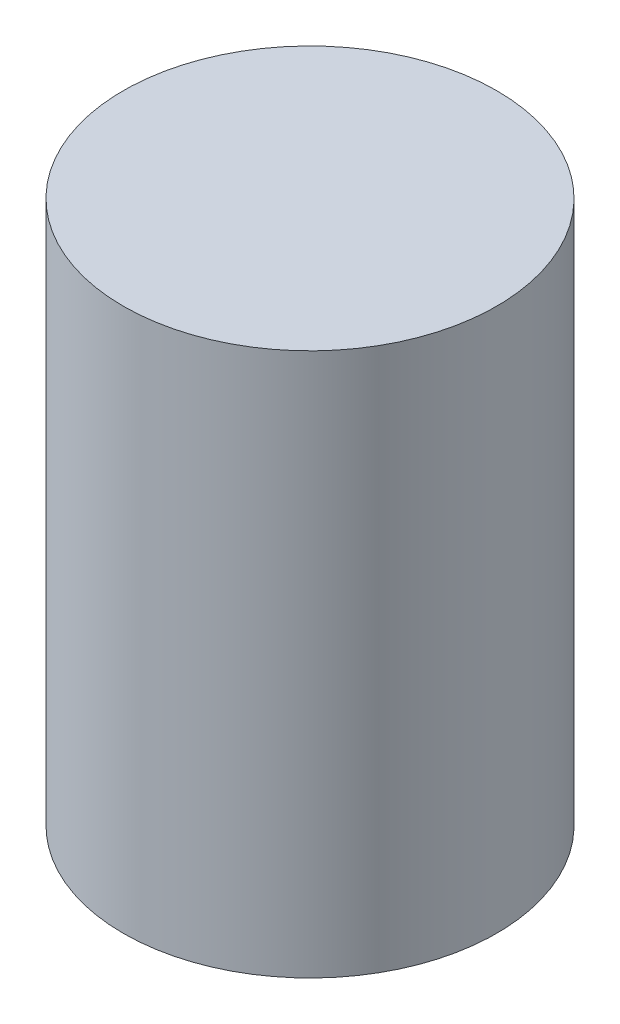
ISO-10303-21;
HEADER;
FILE_DESCRIPTION(('STEP AP214'),'2;1');
FILE_NAME('part.step','',(''),(''),'','','');
FILE_SCHEMA(('AUTOMOTIVE_DESIGN { 1 0 10303 214 1 1 1 1 }'));
ENDSEC;
DATA;
#1=APPLICATION_CONTEXT('core data for automotive mechanical design processes');
#2=APPLICATION_PROTOCOL_DEFINITION('international standard','automotive_design',2000,#1);
#3=PRODUCT_CONTEXT('',#1,'mechanical');
#4=PRODUCT('Part','Part','',(#3));
#5=PRODUCT_RELATED_PRODUCT_CATEGORY('part','',(#4));
#6=PRODUCT_DEFINITION_FORMATION('','',#4);
#7=PRODUCT_DEFINITION_CONTEXT('part definition',#1,'design');
#8=PRODUCT_DEFINITION('design','',#6,#7);
#9=PRODUCT_DEFINITION_SHAPE('','',#8);
#10=(LENGTH_UNIT() NAMED_UNIT(*) SI_UNIT(.MILLI.,.METRE.));
#11=(NAMED_UNIT(*) PLANE_ANGLE_UNIT() SI_UNIT($,.RADIAN.));
#12=(NAMED_UNIT(*) SI_UNIT($,.STERADIAN.) SOLID_ANGLE_UNIT());
#13=UNCERTAINTY_MEASURE_WITH_UNIT(LENGTH_MEASURE(1.E-05),#10,'distance_accuracy_value','');
#14=(GEOMETRIC_REPRESENTATION_CONTEXT(3) GLOBAL_UNCERTAINTY_ASSIGNED_CONTEXT((#13)) GLOBAL_UNIT_ASSIGNED_CONTEXT((#10,
#11,#12)) REPRESENTATION_CONTEXT('',''));
#15=CARTESIAN_POINT('',(0.,0.,0.));
#16=DIRECTION('',(0.,0.,1.));
#17=DIRECTION('',(1.,0.,0.));
#18=AXIS2_PLACEMENT_3D('',#15,#16,#17);
#19=CARTESIAN_POINT('',(0.,40.,0.));
#20=DIRECTION('',(0.,-1.,0.));
#21=DIRECTION('',(0.,0.,-1.));
#22=AXIS2_PLACEMENT_3D('',#19,#20,#21);
#23=CYLINDRICAL_SURFACE('',#22,13.75);
#24=CARTESIAN_POINT('',(0.,40.,0.));
#25=DIRECTION('',(0.,1.,0.));
#26=DIRECTION('',(0.,0.,1.));
#27=AXIS2_PLACEMENT_3D('',#24,#25,#26);
#28=CIRCLE('',#27,13.75);
#29=CARTESIAN_POINT('',(0.,40.,13.75));
#30=VERTEX_POINT('',#29);
#31=EDGE_CURVE('E10',#30,#30,#28,.T.);
#32=ORIENTED_EDGE('',*,*,#31,.F.);
#33=EDGE_LOOP('',(#32));
#34=FACE_BOUND('',#33,.T.);
#35=CARTESIAN_POINT('',(0.,0.,0.));
#36=DIRECTION('',(0.,1.,0.));
#37=DIRECTION('',(0.,0.,1.));
#38=AXIS2_PLACEMENT_3D('',#35,#36,#37);
#39=CIRCLE('',#38,13.75);
#40=CARTESIAN_POINT('',(0.,0.,13.75));
#41=VERTEX_POINT('',#40);
#42=EDGE_CURVE('E37',#41,#41,#39,.T.);
#43=ORIENTED_EDGE('',*,*,#42,.T.);
#44=EDGE_LOOP('',(#43));
#45=FACE_BOUND('',#44,.T.);
#46=ADVANCED_FACE('F40',(#34,#45),#23,.T.);
#47=CARTESIAN_POINT('',(0.,40.,0.));
#48=DIRECTION('',(0.,1.,0.));
#49=DIRECTION('',(0.,0.,1.));
#50=AXIS2_PLACEMENT_3D('',#47,#48,#49);
#51=PLANE('',#50);
#52=ORIENTED_EDGE('',*,*,#31,.T.);
#53=EDGE_LOOP('',(#52));
#54=FACE_BOUND('',#53,.T.);
#55=ADVANCED_FACE('F55',(#54),#51,.T.);
#56=CARTESIAN_POINT('',(0.,0.,0.));
#57=DIRECTION('',(0.,1.,0.));
#58=DIRECTION('',(0.,0.,1.));
#59=AXIS2_PLACEMENT_3D('',#56,#57,#58);
#60=PLANE('',#59);
#61=ORIENTED_EDGE('',*,*,#42,.F.);
#62=EDGE_LOOP('',(#61));
#63=FACE_BOUND('',#62,.T.);
#64=ADVANCED_FACE('F49',(#63),#60,.F.);
#65=CLOSED_SHELL('',(#46,#55,#64));
#66=MANIFOLD_SOLID_BREP('B2',#65);
#67=ADVANCED_BREP_SHAPE_REPRESENTATION('',(#18,#66),#14);
#68=SHAPE_DEFINITION_REPRESENTATION(#9,#67);
ENDSEC;
END-ISO-10303-21;
